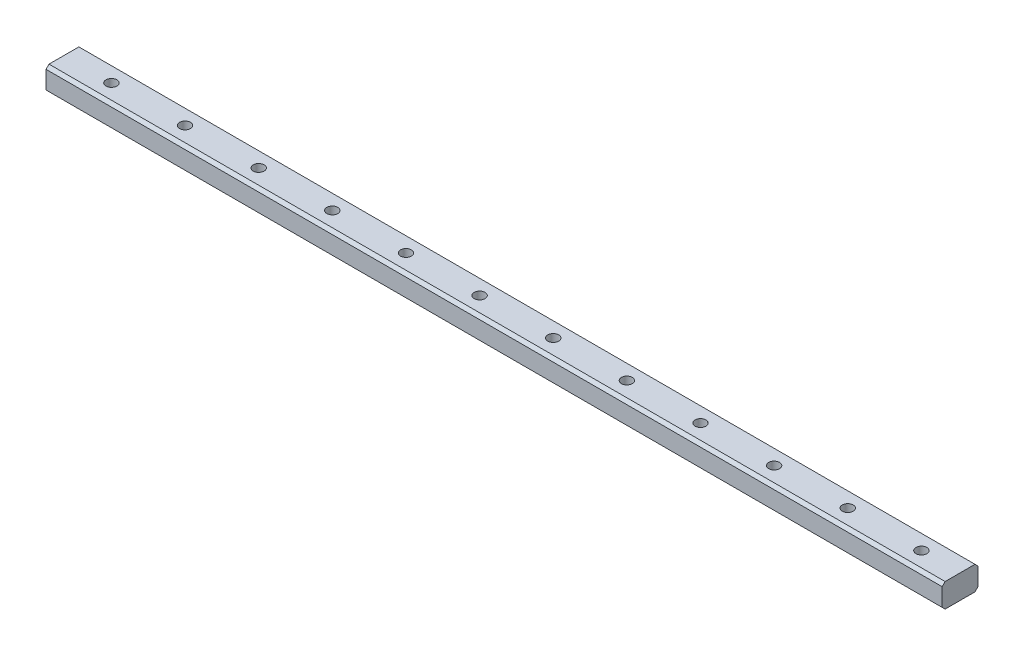
ISO-10303-21;
HEADER;
FILE_DESCRIPTION(('STEP AP214'),'2;1');
FILE_NAME('part.step','',(''),(''),'','','');
FILE_SCHEMA(('AUTOMOTIVE_DESIGN { 1 0 10303 214 1 1 1 1 }'));
ENDSEC;
DATA;
#1=APPLICATION_CONTEXT('core data for automotive mechanical design processes');
#2=APPLICATION_PROTOCOL_DEFINITION('international standard','automotive_design',2000,#1);
#3=PRODUCT_CONTEXT('',#1,'mechanical');
#4=PRODUCT('Part','Part','',(#3));
#5=PRODUCT_RELATED_PRODUCT_CATEGORY('part','',(#4));
#6=PRODUCT_DEFINITION_FORMATION('','',#4);
#7=PRODUCT_DEFINITION_CONTEXT('part definition',#1,'design');
#8=PRODUCT_DEFINITION('design','',#6,#7);
#9=PRODUCT_DEFINITION_SHAPE('','',#8);
#10=(LENGTH_UNIT() NAMED_UNIT(*) SI_UNIT(.MILLI.,.METRE.));
#11=(NAMED_UNIT(*) PLANE_ANGLE_UNIT() SI_UNIT($,.RADIAN.));
#12=(NAMED_UNIT(*) SI_UNIT($,.STERADIAN.) SOLID_ANGLE_UNIT());
#13=UNCERTAINTY_MEASURE_WITH_UNIT(LENGTH_MEASURE(1.E-05),#10,'distance_accuracy_value','');
#14=(GEOMETRIC_REPRESENTATION_CONTEXT(3) GLOBAL_UNCERTAINTY_ASSIGNED_CONTEXT((#13)) GLOBAL_UNIT_ASSIGNED_CONTEXT((#10,
#11,#12)) REPRESENTATION_CONTEXT('',''));
#15=CARTESIAN_POINT('',(0.,0.,0.));
#16=DIRECTION('',(0.,0.,1.));
#17=DIRECTION('',(1.,0.,0.));
#18=AXIS2_PLACEMENT_3D('',#15,#16,#17);
#19=CARTESIAN_POINT('',(-150.,8.,6.00000000000002));
#20=DIRECTION('',(1.,0.,0.));
#21=DIRECTION('',(0.,0.,-1.));
#22=AXIS2_PLACEMENT_3D('',#19,#20,#21);
#23=PLANE('',#22);
#24=DIRECTION('',(0.,-1.,0.));
#25=VECTOR('',#24,1.);
#26=CARTESIAN_POINT('',(-150.,8.,-5.99999999999999));
#27=LINE('',#26,#25);
#28=CARTESIAN_POINT('',(-150.,7.,-5.99999999999999));
#29=VERTEX_POINT('',#28);
#30=CARTESIAN_POINT('',(-150.,0.999999999999973,-5.99999999999999));
#31=VERTEX_POINT('',#30);
#32=EDGE_CURVE('E115',#29,#31,#27,.T.);
#33=ORIENTED_EDGE('',*,*,#32,.T.);
#34=DIRECTION('',(0.,0.707106781186538,-0.707106781186557));
#35=VECTOR('',#34,1.);
#36=CARTESIAN_POINT('',(-150.,0.99999999999999,-6.));
#37=LINE('',#36,#35);
#38=CARTESIAN_POINT('',(-150.,0.,-4.99999999999998));
#39=VERTEX_POINT('',#38);
#40=EDGE_CURVE('E155',#31,#39,#37,.F.);
#41=ORIENTED_EDGE('',*,*,#40,.T.);
#42=DIRECTION('',(0.,0.,1.));
#43=VECTOR('',#42,1.);
#44=CARTESIAN_POINT('',(-150.,0.,6.00000000000002));
#45=LINE('',#44,#43);
#46=CARTESIAN_POINT('',(-150.,0.,5.00000000000002));
#47=VERTEX_POINT('',#46);
#48=EDGE_CURVE('E253',#39,#47,#45,.T.);
#49=ORIENTED_EDGE('',*,*,#48,.T.);
#50=DIRECTION('',(0.,-0.707106781186538,-0.707106781186557));
#51=VECTOR('',#50,1.);
#52=CARTESIAN_POINT('',(-150.,0.999999999999954,6.));
#53=LINE('',#52,#51);
#54=CARTESIAN_POINT('',(-150.,0.999999999999973,6.00000000000002));
#55=VERTEX_POINT('',#54);
#56=EDGE_CURVE('E152',#47,#55,#53,.F.);
#57=ORIENTED_EDGE('',*,*,#56,.T.);
#58=DIRECTION('',(0.,-1.,0.));
#59=VECTOR('',#58,1.);
#60=CARTESIAN_POINT('',(-150.,8.,6.00000000000002));
#61=LINE('',#60,#59);
#62=CARTESIAN_POINT('',(-150.,7.,6.00000000000002));
#63=VERTEX_POINT('',#62);
#64=EDGE_CURVE('E140',#63,#55,#61,.T.);
#65=ORIENTED_EDGE('',*,*,#64,.F.);
#66=DIRECTION('',(0.,0.707106781186557,-0.707106781186538));
#67=VECTOR('',#66,1.);
#68=CARTESIAN_POINT('',(-150.,8.00000000000001,5.00000000000004));
#69=LINE('',#68,#67);
#70=CARTESIAN_POINT('',(-150.,8.,5.00000000000005));
#71=VERTEX_POINT('',#70);
#72=EDGE_CURVE('E123',#63,#71,#69,.T.);
#73=ORIENTED_EDGE('',*,*,#72,.T.);
#74=DIRECTION('',(0.,0.,1.));
#75=VECTOR('',#74,1.);
#76=CARTESIAN_POINT('',(-150.,8.,6.00000000000002));
#77=LINE('',#76,#75);
#78=CARTESIAN_POINT('',(-150.,8.,-5.00000000000001));
#79=VERTEX_POINT('',#78);
#80=EDGE_CURVE('E117',#79,#71,#77,.T.);
#81=ORIENTED_EDGE('',*,*,#80,.F.);
#82=DIRECTION('',(0.,-0.707106781186557,-0.707106781186538));
#83=VECTOR('',#82,1.);
#84=CARTESIAN_POINT('',(-150.,7.99999999999999,-5.00000000000002));
#85=LINE('',#84,#83);
#86=EDGE_CURVE('E113',#79,#29,#85,.T.);
#87=ORIENTED_EDGE('',*,*,#86,.T.);
#88=EDGE_LOOP('',(#33,#41,#49,#57,#65,#73,#81,#87));
#89=FACE_BOUND('',#88,.T.);
#90=ADVANCED_FACE('F42',(#89),#23,.F.);
#91=CARTESIAN_POINT('',(150.,8.,5.99999999999998));
#92=DIRECTION('',(0.,0.,-1.));
#93=DIRECTION('',(-1.,0.,0.));
#94=AXIS2_PLACEMENT_3D('',#91,#92,#93);
#95=PLANE('',#94);
#96=ORIENTED_EDGE('',*,*,#64,.T.);
#97=DIRECTION('',(1.,0.,0.));
#98=VECTOR('',#97,1.);
#99=CARTESIAN_POINT('',(150.,0.999999999999973,5.99999999999998));
#100=LINE('',#99,#98);
#101=CARTESIAN_POINT('',(150.,0.999999999999973,5.99999999999998));
#102=VERTEX_POINT('',#101);
#103=EDGE_CURVE('E176',#55,#102,#100,.T.);
#104=ORIENTED_EDGE('',*,*,#103,.T.);
#105=DIRECTION('',(0.,-1.,0.));
#106=VECTOR('',#105,1.);
#107=CARTESIAN_POINT('',(150.,8.,5.99999999999998));
#108=LINE('',#107,#106);
#109=CARTESIAN_POINT('',(150.,7.,5.99999999999998));
#110=VERTEX_POINT('',#109);
#111=EDGE_CURVE('E146',#110,#102,#108,.T.);
#112=ORIENTED_EDGE('',*,*,#111,.F.);
#113=DIRECTION('',(-1.,0.,0.));
#114=VECTOR('',#113,1.);
#115=CARTESIAN_POINT('',(-150.,7.,6.00000000000002));
#116=LINE('',#115,#114);
#117=EDGE_CURVE('E173',#110,#63,#116,.T.);
#118=ORIENTED_EDGE('',*,*,#117,.T.);
#119=EDGE_LOOP('',(#96,#104,#112,#118));
#120=FACE_BOUND('',#119,.T.);
#121=ADVANCED_FACE('F275',(#120),#95,.F.);
#122=CARTESIAN_POINT('',(150.,8.,5.99999999999998));
#123=DIRECTION('',(-1.,0.,0.));
#124=DIRECTION('',(0.,0.,1.));
#125=AXIS2_PLACEMENT_3D('',#122,#123,#124);
#126=PLANE('',#125);
#127=DIRECTION('',(0.,0.,-1.));
#128=VECTOR('',#127,1.);
#129=CARTESIAN_POINT('',(150.,0.,5.99999999999998));
#130=LINE('',#129,#128);
#131=CARTESIAN_POINT('',(150.,0.,4.99999999999998));
#132=VERTEX_POINT('',#131);
#133=CARTESIAN_POINT('',(150.,0.,-5.00000000000002));
#134=VERTEX_POINT('',#133);
#135=EDGE_CURVE('E259',#132,#134,#130,.T.);
#136=ORIENTED_EDGE('',*,*,#135,.T.);
#137=DIRECTION('',(0.,-0.707106781186538,0.707106781186557));
#138=VECTOR('',#137,1.);
#139=CARTESIAN_POINT('',(150.,0.999999999999973,-6.00000000000002));
#140=LINE('',#139,#138);
#141=CARTESIAN_POINT('',(150.,0.999999999999973,-6.00000000000002));
#142=VERTEX_POINT('',#141);
#143=EDGE_CURVE('E170',#134,#142,#140,.F.);
#144=ORIENTED_EDGE('',*,*,#143,.T.);
#145=DIRECTION('',(0.,-1.,0.));
#146=VECTOR('',#145,1.);
#147=CARTESIAN_POINT('',(150.,8.,-6.00000000000002));
#148=LINE('',#147,#146);
#149=CARTESIAN_POINT('',(150.,7.,-6.00000000000002));
#150=VERTEX_POINT('',#149);
#151=EDGE_CURVE('E134',#150,#142,#148,.T.);
#152=ORIENTED_EDGE('',*,*,#151,.F.);
#153=DIRECTION('',(0.,0.707106781186557,0.707106781186538));
#154=VECTOR('',#153,1.);
#155=CARTESIAN_POINT('',(150.,8.00000000000001,-5.00000000000004));
#156=LINE('',#155,#154);
#157=CARTESIAN_POINT('',(150.,8.,-5.00000000000005));
#158=VERTEX_POINT('',#157);
#159=EDGE_CURVE('E138',#150,#158,#156,.T.);
#160=ORIENTED_EDGE('',*,*,#159,.T.);
#161=DIRECTION('',(0.,0.,-1.));
#162=VECTOR('',#161,1.);
#163=CARTESIAN_POINT('',(150.,8.,5.99999999999998));
#164=LINE('',#163,#162);
#165=CARTESIAN_POINT('',(150.,8.,5.00000000000001));
#166=VERTEX_POINT('',#165);
#167=EDGE_CURVE('E135',#166,#158,#164,.T.);
#168=ORIENTED_EDGE('',*,*,#167,.F.);
#169=DIRECTION('',(0.,-0.707106781186557,0.707106781186538));
#170=VECTOR('',#169,1.);
#171=CARTESIAN_POINT('',(150.,7.99999999999999,5.00000000000002));
#172=LINE('',#171,#170);
#173=EDGE_CURVE('E69',#166,#110,#172,.T.);
#174=ORIENTED_EDGE('',*,*,#173,.T.);
#175=ORIENTED_EDGE('',*,*,#111,.T.);
#176=DIRECTION('',(0.,0.707106781186538,0.707106781186557));
#177=VECTOR('',#176,1.);
#178=CARTESIAN_POINT('',(150.,0.999999999999973,5.99999999999998));
#179=LINE('',#178,#177);
#180=EDGE_CURVE('E61',#102,#132,#179,.F.);
#181=ORIENTED_EDGE('',*,*,#180,.T.);
#182=EDGE_LOOP('',(#136,#144,#152,#160,#168,#174,#175,#181));
#183=FACE_BOUND('',#182,.T.);
#184=ADVANCED_FACE('F271',(#183),#126,.F.);
#185=CARTESIAN_POINT('',(150.,8.,-6.00000000000002));
#186=DIRECTION('',(0.,0.,1.));
#187=DIRECTION('',(1.,0.,0.));
#188=AXIS2_PLACEMENT_3D('',#185,#186,#187);
#189=PLANE('',#188);
#190=ORIENTED_EDGE('',*,*,#151,.T.);
#191=DIRECTION('',(-1.,0.,0.));
#192=VECTOR('',#191,1.);
#193=CARTESIAN_POINT('',(150.,0.999999999999973,-6.00000000000002));
#194=LINE('',#193,#192);
#195=EDGE_CURVE('E124',#142,#31,#194,.T.);
#196=ORIENTED_EDGE('',*,*,#195,.T.);
#197=ORIENTED_EDGE('',*,*,#32,.F.);
#198=DIRECTION('',(1.,0.,0.));
#199=VECTOR('',#198,1.);
#200=CARTESIAN_POINT('',(150.,7.,-6.00000000000002));
#201=LINE('',#200,#199);
#202=EDGE_CURVE('E130',#29,#150,#201,.T.);
#203=ORIENTED_EDGE('',*,*,#202,.T.);
#204=EDGE_LOOP('',(#190,#196,#197,#203));
#205=FACE_BOUND('',#204,.T.);
#206=ADVANCED_FACE('F129',(#205),#189,.F.);
#207=CARTESIAN_POINT('',(0.,8.,0.));
#208=DIRECTION('',(0.,1.,0.));
#209=DIRECTION('',(0.,0.,1.));
#210=AXIS2_PLACEMENT_3D('',#207,#208,#209);
#211=PLANE('',#210);
#212=CARTESIAN_POINT('',(112.4,8.,0.));
#213=DIRECTION('',(0.,1.,0.));
#214=DIRECTION('',(0.,0.,1.));
#215=AXIS2_PLACEMENT_3D('',#212,#213,#214);
#216=CIRCLE('',#215,1.82499999999999);
#217=CARTESIAN_POINT('',(112.4,8.,1.82499999999999));
#218=VERTEX_POINT('',#217);
#219=EDGE_CURVE('E192',#218,#218,#216,.T.);
#220=ORIENTED_EDGE('',*,*,#219,.F.);
#221=EDGE_LOOP('',(#220));
#222=FACE_BOUND('',#221,.T.);
#223=CARTESIAN_POINT('',(87.7499999999999,8.,0.));
#224=DIRECTION('',(0.,1.,0.));
#225=DIRECTION('',(0.,0.,1.));
#226=AXIS2_PLACEMENT_3D('',#223,#224,#225);
#227=CIRCLE('',#226,1.82499999999999);
#228=CARTESIAN_POINT('',(87.7499999999999,8.,1.82499999999999));
#229=VERTEX_POINT('',#228);
#230=EDGE_CURVE('E640',#229,#229,#227,.T.);
#231=ORIENTED_EDGE('',*,*,#230,.F.);
#232=EDGE_LOOP('',(#231));
#233=FACE_BOUND('',#232,.T.);
#234=CARTESIAN_POINT('',(63.0999999999999,8.,0.));
#235=DIRECTION('',(0.,1.,0.));
#236=DIRECTION('',(0.,0.,1.));
#237=AXIS2_PLACEMENT_3D('',#234,#235,#236);
#238=CIRCLE('',#237,1.82499999999999);
#239=CARTESIAN_POINT('',(63.0999999999999,8.,1.82499999999999));
#240=VERTEX_POINT('',#239);
#241=EDGE_CURVE('E636',#240,#240,#238,.T.);
#242=ORIENTED_EDGE('',*,*,#241,.F.);
#243=EDGE_LOOP('',(#242));
#244=FACE_BOUND('',#243,.T.);
#245=CARTESIAN_POINT('',(38.4499999999999,8.,0.));
#246=DIRECTION('',(0.,1.,0.));
#247=DIRECTION('',(0.,0.,1.));
#248=AXIS2_PLACEMENT_3D('',#245,#246,#247);
#249=CIRCLE('',#248,1.82499999999999);
#250=CARTESIAN_POINT('',(38.4499999999999,8.,1.82499999999999));
#251=VERTEX_POINT('',#250);
#252=EDGE_CURVE('E632',#251,#251,#249,.T.);
#253=ORIENTED_EDGE('',*,*,#252,.F.);
#254=EDGE_LOOP('',(#253));
#255=FACE_BOUND('',#254,.T.);
#256=CARTESIAN_POINT('',(13.7999999999999,8.,0.));
#257=DIRECTION('',(0.,1.,0.));
#258=DIRECTION('',(0.,0.,1.));
#259=AXIS2_PLACEMENT_3D('',#256,#257,#258);
#260=CIRCLE('',#259,1.82499999999999);
#261=CARTESIAN_POINT('',(13.7999999999999,8.,1.82499999999999));
#262=VERTEX_POINT('',#261);
#263=EDGE_CURVE('E628',#262,#262,#260,.T.);
#264=ORIENTED_EDGE('',*,*,#263,.F.);
#265=EDGE_LOOP('',(#264));
#266=FACE_BOUND('',#265,.T.);
#267=CARTESIAN_POINT('',(-10.8500000000001,8.,0.));
#268=DIRECTION('',(0.,1.,0.));
#269=DIRECTION('',(0.,0.,1.));
#270=AXIS2_PLACEMENT_3D('',#267,#268,#269);
#271=CIRCLE('',#270,1.82499999999999);
#272=CARTESIAN_POINT('',(-10.8500000000001,8.,1.82499999999999));
#273=VERTEX_POINT('',#272);
#274=EDGE_CURVE('E624',#273,#273,#271,.T.);
#275=ORIENTED_EDGE('',*,*,#274,.F.);
#276=EDGE_LOOP('',(#275));
#277=FACE_BOUND('',#276,.T.);
#278=CARTESIAN_POINT('',(-35.5000000000001,8.,0.));
#279=DIRECTION('',(0.,1.,0.));
#280=DIRECTION('',(0.,0.,1.));
#281=AXIS2_PLACEMENT_3D('',#278,#279,#280);
#282=CIRCLE('',#281,1.82499999999999);
#283=CARTESIAN_POINT('',(-35.5000000000001,8.,1.82499999999999));
#284=VERTEX_POINT('',#283);
#285=EDGE_CURVE('E620',#284,#284,#282,.T.);
#286=ORIENTED_EDGE('',*,*,#285,.F.);
#287=EDGE_LOOP('',(#286));
#288=FACE_BOUND('',#287,.T.);
#289=CARTESIAN_POINT('',(-60.1500000000001,8.,0.));
#290=DIRECTION('',(0.,1.,0.));
#291=DIRECTION('',(0.,0.,1.));
#292=AXIS2_PLACEMENT_3D('',#289,#290,#291);
#293=CIRCLE('',#292,1.82499999999999);
#294=CARTESIAN_POINT('',(-60.1500000000001,8.,1.82499999999999));
#295=VERTEX_POINT('',#294);
#296=EDGE_CURVE('E616',#295,#295,#293,.T.);
#297=ORIENTED_EDGE('',*,*,#296,.F.);
#298=EDGE_LOOP('',(#297));
#299=FACE_BOUND('',#298,.T.);
#300=CARTESIAN_POINT('',(-84.8000000000001,8.,0.));
#301=DIRECTION('',(0.,1.,0.));
#302=DIRECTION('',(0.,0.,1.));
#303=AXIS2_PLACEMENT_3D('',#300,#301,#302);
#304=CIRCLE('',#303,1.82499999999999);
#305=CARTESIAN_POINT('',(-84.8000000000001,8.,1.82499999999999));
#306=VERTEX_POINT('',#305);
#307=EDGE_CURVE('E612',#306,#306,#304,.T.);
#308=ORIENTED_EDGE('',*,*,#307,.F.);
#309=EDGE_LOOP('',(#308));
#310=FACE_BOUND('',#309,.T.);
#311=CARTESIAN_POINT('',(-109.45,8.,0.));
#312=DIRECTION('',(0.,1.,0.));
#313=DIRECTION('',(0.,0.,1.));
#314=AXIS2_PLACEMENT_3D('',#311,#312,#313);
#315=CIRCLE('',#314,1.82499999999999);
#316=CARTESIAN_POINT('',(-109.45,8.,1.82499999999999));
#317=VERTEX_POINT('',#316);
#318=EDGE_CURVE('E608',#317,#317,#315,.T.);
#319=ORIENTED_EDGE('',*,*,#318,.F.);
#320=EDGE_LOOP('',(#319));
#321=FACE_BOUND('',#320,.T.);
#322=CARTESIAN_POINT('',(-134.1,8.,0.));
#323=DIRECTION('',(0.,1.,0.));
#324=DIRECTION('',(0.,0.,1.));
#325=AXIS2_PLACEMENT_3D('',#322,#323,#324);
#326=CIRCLE('',#325,1.82499999999999);
#327=CARTESIAN_POINT('',(-134.1,8.,1.82499999999999));
#328=VERTEX_POINT('',#327);
#329=EDGE_CURVE('E487',#328,#328,#326,.T.);
#330=ORIENTED_EDGE('',*,*,#329,.F.);
#331=EDGE_LOOP('',(#330));
#332=FACE_BOUND('',#331,.T.);
#333=CARTESIAN_POINT('',(137.05,8.,0.));
#334=DIRECTION('',(0.,1.,0.));
#335=DIRECTION('',(0.,0.,1.));
#336=AXIS2_PLACEMENT_3D('',#333,#334,#335);
#337=CIRCLE('',#336,1.82499999999999);
#338=CARTESIAN_POINT('',(137.05,8.,1.82499999999999));
#339=VERTEX_POINT('',#338);
#340=EDGE_CURVE('E186',#339,#339,#337,.T.);
#341=ORIENTED_EDGE('',*,*,#340,.F.);
#342=EDGE_LOOP('',(#341));
#343=FACE_BOUND('',#342,.T.);
#344=ORIENTED_EDGE('',*,*,#80,.T.);
#345=DIRECTION('',(1.,0.,0.));
#346=VECTOR('',#345,1.);
#347=CARTESIAN_POINT('',(150.,8.,5.00000000000001));
#348=LINE('',#347,#346);
#349=EDGE_CURVE('E11',#71,#166,#348,.T.);
#350=ORIENTED_EDGE('',*,*,#349,.T.);
#351=ORIENTED_EDGE('',*,*,#167,.T.);
#352=DIRECTION('',(-1.,0.,0.));
#353=VECTOR('',#352,1.);
#354=CARTESIAN_POINT('',(-150.,8.,-5.00000000000001));
#355=LINE('',#354,#353);
#356=EDGE_CURVE('E53',#158,#79,#355,.T.);
#357=ORIENTED_EDGE('',*,*,#356,.T.);
#358=EDGE_LOOP('',(#344,#350,#351,#357));
#359=FACE_BOUND('',#358,.T.);
#360=ADVANCED_FACE('F282',(#222,#233,#244,#255,#266,#277,#288,#299,#310,#321,#332,#343,#359),
#211,.T.);
#361=CARTESIAN_POINT('',(0.,0.,0.));
#362=DIRECTION('',(0.,1.,0.));
#363=DIRECTION('',(0.,0.,1.));
#364=AXIS2_PLACEMENT_3D('',#361,#362,#363);
#365=PLANE('',#364);
#366=CARTESIAN_POINT('',(112.4,0.,0.));
#367=DIRECTION('',(0.,1.,0.));
#368=DIRECTION('',(0.,0.,1.));
#369=AXIS2_PLACEMENT_3D('',#366,#367,#368);
#370=CIRCLE('',#369,2.95);
#371=CARTESIAN_POINT('',(112.4,0.,2.95));
#372=VERTEX_POINT('',#371);
#373=EDGE_CURVE('E480',#372,#372,#370,.T.);
#374=ORIENTED_EDGE('',*,*,#373,.T.);
#375=EDGE_LOOP('',(#374));
#376=FACE_BOUND('',#375,.T.);
#377=CARTESIAN_POINT('',(87.7499999999999,0.,0.));
#378=DIRECTION('',(0.,1.,0.));
#379=DIRECTION('',(0.,0.,1.));
#380=AXIS2_PLACEMENT_3D('',#377,#378,#379);
#381=CIRCLE('',#380,2.95);
#382=CARTESIAN_POINT('',(87.7499999999999,0.,2.95));
#383=VERTEX_POINT('',#382);
#384=EDGE_CURVE('E493',#383,#383,#381,.T.);
#385=ORIENTED_EDGE('',*,*,#384,.T.);
#386=EDGE_LOOP('',(#385));
#387=FACE_BOUND('',#386,.T.);
#388=CARTESIAN_POINT('',(63.0999999999999,0.,0.));
#389=DIRECTION('',(0.,1.,0.));
#390=DIRECTION('',(0.,0.,1.));
#391=AXIS2_PLACEMENT_3D('',#388,#389,#390);
#392=CIRCLE('',#391,2.95);
#393=CARTESIAN_POINT('',(63.0999999999999,0.,2.95));
#394=VERTEX_POINT('',#393);
#395=EDGE_CURVE('E501',#394,#394,#392,.T.);
#396=ORIENTED_EDGE('',*,*,#395,.T.);
#397=EDGE_LOOP('',(#396));
#398=FACE_BOUND('',#397,.T.);
#399=CARTESIAN_POINT('',(38.4499999999999,0.,0.));
#400=DIRECTION('',(0.,1.,0.));
#401=DIRECTION('',(0.,0.,1.));
#402=AXIS2_PLACEMENT_3D('',#399,#400,#401);
#403=CIRCLE('',#402,2.95);
#404=CARTESIAN_POINT('',(38.4499999999999,0.,2.95));
#405=VERTEX_POINT('',#404);
#406=EDGE_CURVE('E509',#405,#405,#403,.T.);
#407=ORIENTED_EDGE('',*,*,#406,.T.);
#408=EDGE_LOOP('',(#407));
#409=FACE_BOUND('',#408,.T.);
#410=CARTESIAN_POINT('',(13.7999999999999,0.,0.));
#411=DIRECTION('',(0.,1.,0.));
#412=DIRECTION('',(0.,0.,1.));
#413=AXIS2_PLACEMENT_3D('',#410,#411,#412);
#414=CIRCLE('',#413,2.95);
#415=CARTESIAN_POINT('',(13.7999999999999,0.,2.95));
#416=VERTEX_POINT('',#415);
#417=EDGE_CURVE('E517',#416,#416,#414,.T.);
#418=ORIENTED_EDGE('',*,*,#417,.T.);
#419=EDGE_LOOP('',(#418));
#420=FACE_BOUND('',#419,.T.);
#421=CARTESIAN_POINT('',(-10.8500000000001,0.,0.));
#422=DIRECTION('',(0.,1.,0.));
#423=DIRECTION('',(0.,0.,1.));
#424=AXIS2_PLACEMENT_3D('',#421,#422,#423);
#425=CIRCLE('',#424,2.95);
#426=CARTESIAN_POINT('',(-10.8500000000001,0.,2.95));
#427=VERTEX_POINT('',#426);
#428=EDGE_CURVE('E525',#427,#427,#425,.T.);
#429=ORIENTED_EDGE('',*,*,#428,.T.);
#430=EDGE_LOOP('',(#429));
#431=FACE_BOUND('',#430,.T.);
#432=CARTESIAN_POINT('',(-35.5000000000001,0.,0.));
#433=DIRECTION('',(0.,1.,0.));
#434=DIRECTION('',(0.,0.,1.));
#435=AXIS2_PLACEMENT_3D('',#432,#433,#434);
#436=CIRCLE('',#435,2.95);
#437=CARTESIAN_POINT('',(-35.5000000000001,0.,2.95));
#438=VERTEX_POINT('',#437);
#439=EDGE_CURVE('E533',#438,#438,#436,.T.);
#440=ORIENTED_EDGE('',*,*,#439,.T.);
#441=EDGE_LOOP('',(#440));
#442=FACE_BOUND('',#441,.T.);
#443=CARTESIAN_POINT('',(-60.1500000000001,0.,0.));
#444=DIRECTION('',(0.,1.,0.));
#445=DIRECTION('',(0.,0.,1.));
#446=AXIS2_PLACEMENT_3D('',#443,#444,#445);
#447=CIRCLE('',#446,2.95);
#448=CARTESIAN_POINT('',(-60.1500000000001,0.,2.95));
#449=VERTEX_POINT('',#448);
#450=EDGE_CURVE('E541',#449,#449,#447,.T.);
#451=ORIENTED_EDGE('',*,*,#450,.T.);
#452=EDGE_LOOP('',(#451));
#453=FACE_BOUND('',#452,.T.);
#454=CARTESIAN_POINT('',(-84.8000000000001,0.,0.));
#455=DIRECTION('',(0.,1.,0.));
#456=DIRECTION('',(0.,0.,1.));
#457=AXIS2_PLACEMENT_3D('',#454,#455,#456);
#458=CIRCLE('',#457,2.95);
#459=CARTESIAN_POINT('',(-84.8000000000001,0.,2.95));
#460=VERTEX_POINT('',#459);
#461=EDGE_CURVE('E549',#460,#460,#458,.T.);
#462=ORIENTED_EDGE('',*,*,#461,.T.);
#463=EDGE_LOOP('',(#462));
#464=FACE_BOUND('',#463,.T.);
#465=CARTESIAN_POINT('',(-109.45,0.,0.));
#466=DIRECTION('',(0.,1.,0.));
#467=DIRECTION('',(0.,0.,1.));
#468=AXIS2_PLACEMENT_3D('',#465,#466,#467);
#469=CIRCLE('',#468,2.95);
#470=CARTESIAN_POINT('',(-109.45,0.,2.95));
#471=VERTEX_POINT('',#470);
#472=EDGE_CURVE('E241',#471,#471,#469,.T.);
#473=ORIENTED_EDGE('',*,*,#472,.T.);
#474=EDGE_LOOP('',(#473));
#475=FACE_BOUND('',#474,.T.);
#476=CARTESIAN_POINT('',(-134.1,0.,0.));
#477=DIRECTION('',(0.,1.,0.));
#478=DIRECTION('',(0.,0.,1.));
#479=AXIS2_PLACEMENT_3D('',#476,#477,#478);
#480=CIRCLE('',#479,2.95);
#481=CARTESIAN_POINT('',(-134.1,0.,2.95));
#482=VERTEX_POINT('',#481);
#483=EDGE_CURVE('E230',#482,#482,#480,.T.);
#484=ORIENTED_EDGE('',*,*,#483,.T.);
#485=EDGE_LOOP('',(#484));
#486=FACE_BOUND('',#485,.T.);
#487=CARTESIAN_POINT('',(137.05,0.,0.));
#488=DIRECTION('',(0.,1.,0.));
#489=DIRECTION('',(0.,0.,1.));
#490=AXIS2_PLACEMENT_3D('',#487,#488,#489);
#491=CIRCLE('',#490,2.95);
#492=CARTESIAN_POINT('',(137.05,0.,2.95));
#493=VERTEX_POINT('',#492);
#494=EDGE_CURVE('E185',#493,#493,#491,.T.);
#495=ORIENTED_EDGE('',*,*,#494,.T.);
#496=EDGE_LOOP('',(#495));
#497=FACE_BOUND('',#496,.T.);
#498=ORIENTED_EDGE('',*,*,#48,.F.);
#499=DIRECTION('',(1.,0.,0.));
#500=VECTOR('',#499,1.);
#501=CARTESIAN_POINT('',(0.,0.,-5.));
#502=LINE('',#501,#500);
#503=EDGE_CURVE('E161',#39,#134,#502,.T.);
#504=ORIENTED_EDGE('',*,*,#503,.T.);
#505=ORIENTED_EDGE('',*,*,#135,.F.);
#506=DIRECTION('',(-1.,0.,0.));
#507=VECTOR('',#506,1.);
#508=CARTESIAN_POINT('',(0.,0.,5.));
#509=LINE('',#508,#507);
#510=EDGE_CURVE('E158',#132,#47,#509,.T.);
#511=ORIENTED_EDGE('',*,*,#510,.T.);
#512=EDGE_LOOP('',(#498,#504,#505,#511));
#513=FACE_BOUND('',#512,.T.);
#514=ADVANCED_FACE('F290',(#376,#387,#398,#409,#420,#431,#442,#453,#464,#475,#486,#497,#513),
#365,.F.);
#515=CARTESIAN_POINT('',(150.,0.999999999999973,-6.00000000000002));
#516=DIRECTION('',(0.,0.707106781186557,0.707106781186538));
#517=DIRECTION('',(-1.,0.,0.));
#518=AXIS2_PLACEMENT_3D('',#515,#516,#517);
#519=PLANE('',#518);
#520=ORIENTED_EDGE('',*,*,#143,.F.);
#521=ORIENTED_EDGE('',*,*,#503,.F.);
#522=ORIENTED_EDGE('',*,*,#40,.F.);
#523=ORIENTED_EDGE('',*,*,#195,.F.);
#524=EDGE_LOOP('',(#520,#521,#522,#523));
#525=FACE_BOUND('',#524,.T.);
#526=ADVANCED_FACE('F285',(#525),#519,.F.);
#527=CARTESIAN_POINT('',(150.,0.999999999999973,5.99999999999998));
#528=DIRECTION('',(0.,0.707106781186557,-0.707106781186538));
#529=DIRECTION('',(1.,0.,0.));
#530=AXIS2_PLACEMENT_3D('',#527,#528,#529);
#531=PLANE('',#530);
#532=ORIENTED_EDGE('',*,*,#56,.F.);
#533=ORIENTED_EDGE('',*,*,#510,.F.);
#534=ORIENTED_EDGE('',*,*,#180,.F.);
#535=ORIENTED_EDGE('',*,*,#103,.F.);
#536=EDGE_LOOP('',(#532,#533,#534,#535));
#537=FACE_BOUND('',#536,.T.);
#538=ADVANCED_FACE('F291',(#537),#531,.F.);
#539=CARTESIAN_POINT('',(0.,8.,5.00000000000003));
#540=DIRECTION('',(0.,0.707106781186538,0.707106781186557));
#541=DIRECTION('',(-1.,0.,0.));
#542=AXIS2_PLACEMENT_3D('',#539,#540,#541);
#543=PLANE('',#542);
#544=ORIENTED_EDGE('',*,*,#72,.F.);
#545=ORIENTED_EDGE('',*,*,#117,.F.);
#546=ORIENTED_EDGE('',*,*,#173,.F.);
#547=ORIENTED_EDGE('',*,*,#349,.F.);
#548=EDGE_LOOP('',(#544,#545,#546,#547));
#549=FACE_BOUND('',#548,.T.);
#550=ADVANCED_FACE('F279',(#549),#543,.T.);
#551=CARTESIAN_POINT('',(0.,8.,-5.00000000000003));
#552=DIRECTION('',(0.,0.707106781186538,-0.707106781186557));
#553=DIRECTION('',(1.,0.,0.));
#554=AXIS2_PLACEMENT_3D('',#551,#552,#553);
#555=PLANE('',#554);
#556=ORIENTED_EDGE('',*,*,#159,.F.);
#557=ORIENTED_EDGE('',*,*,#202,.F.);
#558=ORIENTED_EDGE('',*,*,#86,.F.);
#559=ORIENTED_EDGE('',*,*,#356,.F.);
#560=EDGE_LOOP('',(#556,#557,#558,#559));
#561=FACE_BOUND('',#560,.T.);
#562=ADVANCED_FACE('F45',(#561),#555,.T.);
#563=CARTESIAN_POINT('',(137.05,5.05,0.));
#564=DIRECTION('',(0.,-1.,0.));
#565=DIRECTION('',(0.,0.,-1.));
#566=AXIS2_PLACEMENT_3D('',#563,#564,#565);
#567=CYLINDRICAL_SURFACE('',#566,2.95);
#568=CARTESIAN_POINT('',(137.05,5.05,0.));
#569=DIRECTION('',(0.,1.,0.));
#570=DIRECTION('',(0.,0.,1.));
#571=AXIS2_PLACEMENT_3D('',#568,#569,#570);
#572=CIRCLE('',#571,2.95);
#573=CARTESIAN_POINT('',(137.05,5.05,2.95));
#574=VERTEX_POINT('',#573);
#575=EDGE_CURVE('E249',#574,#574,#572,.T.);
#576=ORIENTED_EDGE('',*,*,#575,.T.);
#577=EDGE_LOOP('',(#576));
#578=FACE_BOUND('',#577,.T.);
#579=ORIENTED_EDGE('',*,*,#494,.F.);
#580=EDGE_LOOP('',(#579));
#581=FACE_BOUND('',#580,.T.);
#582=ADVANCED_FACE('F327',(#578,#581),#567,.F.);
#583=CARTESIAN_POINT('',(137.05,5.05,0.));
#584=DIRECTION('',(0.,1.,0.));
#585=DIRECTION('',(0.,0.,1.));
#586=AXIS2_PLACEMENT_3D('',#583,#584,#585);
#587=PLANE('',#586);
#588=CARTESIAN_POINT('',(137.05,5.05,0.));
#589=DIRECTION('',(0.,1.,0.));
#590=DIRECTION('',(0.,0.,1.));
#591=AXIS2_PLACEMENT_3D('',#588,#589,#590);
#592=CIRCLE('',#591,1.82499999999999);
#593=CARTESIAN_POINT('',(137.05,5.05,1.82499999999999));
#594=VERTEX_POINT('',#593);
#595=EDGE_CURVE('E181',#594,#594,#592,.F.);
#596=ORIENTED_EDGE('',*,*,#595,.F.);
#597=EDGE_LOOP('',(#596));
#598=FACE_BOUND('',#597,.T.);
#599=ORIENTED_EDGE('',*,*,#575,.F.);
#600=EDGE_LOOP('',(#599));
#601=FACE_BOUND('',#600,.T.);
#602=ADVANCED_FACE('F330',(#598,#601),#587,.F.);
#603=CARTESIAN_POINT('',(137.05,8.,0.));
#604=DIRECTION('',(0.,-1.,0.));
#605=DIRECTION('',(0.,0.,-1.));
#606=AXIS2_PLACEMENT_3D('',#603,#604,#605);
#607=CYLINDRICAL_SURFACE('',#606,1.82499999999999);
#608=ORIENTED_EDGE('',*,*,#340,.T.);
#609=EDGE_LOOP('',(#608));
#610=FACE_BOUND('',#609,.T.);
#611=ORIENTED_EDGE('',*,*,#595,.T.);
#612=EDGE_LOOP('',(#611));
#613=FACE_BOUND('',#612,.T.);
#614=ADVANCED_FACE('F334',(#610,#613),#607,.F.);
#615=CARTESIAN_POINT('',(-134.1,5.05,0.));
#616=DIRECTION('',(0.,-1.,0.));
#617=DIRECTION('',(0.,0.,-1.));
#618=AXIS2_PLACEMENT_3D('',#615,#616,#617);
#619=CYLINDRICAL_SURFACE('',#618,2.95);
#620=CARTESIAN_POINT('',(-134.1,5.05,0.));
#621=DIRECTION('',(0.,1.,0.));
#622=DIRECTION('',(0.,0.,1.));
#623=AXIS2_PLACEMENT_3D('',#620,#621,#622);
#624=CIRCLE('',#623,2.95);
#625=CARTESIAN_POINT('',(-134.1,5.05,2.95));
#626=VERTEX_POINT('',#625);
#627=EDGE_CURVE('E235',#626,#626,#624,.T.);
#628=ORIENTED_EDGE('',*,*,#627,.T.);
#629=EDGE_LOOP('',(#628));
#630=FACE_BOUND('',#629,.T.);
#631=ORIENTED_EDGE('',*,*,#483,.F.);
#632=EDGE_LOOP('',(#631));
#633=FACE_BOUND('',#632,.T.);
#634=ADVANCED_FACE('F338',(#630,#633),#619,.F.);
#635=CARTESIAN_POINT('',(-134.1,5.05,0.));
#636=DIRECTION('',(0.,1.,0.));
#637=DIRECTION('',(0.,0.,1.));
#638=AXIS2_PLACEMENT_3D('',#635,#636,#637);
#639=PLANE('',#638);
#640=CARTESIAN_POINT('',(-134.1,5.05,0.));
#641=DIRECTION('',(0.,1.,0.));
#642=DIRECTION('',(0.,0.,1.));
#643=AXIS2_PLACEMENT_3D('',#640,#641,#642);
#644=CIRCLE('',#643,1.82499999999999);
#645=CARTESIAN_POINT('',(-134.1,5.05,1.82499999999999));
#646=VERTEX_POINT('',#645);
#647=EDGE_CURVE('E47',#646,#646,#644,.F.);
#648=ORIENTED_EDGE('',*,*,#647,.F.);
#649=EDGE_LOOP('',(#648));
#650=FACE_BOUND('',#649,.T.);
#651=ORIENTED_EDGE('',*,*,#627,.F.);
#652=EDGE_LOOP('',(#651));
#653=FACE_BOUND('',#652,.T.);
#654=ADVANCED_FACE('F342',(#650,#653),#639,.F.);
#655=CARTESIAN_POINT('',(-109.45,5.05,0.));
#656=DIRECTION('',(0.,-1.,0.));
#657=DIRECTION('',(0.,0.,-1.));
#658=AXIS2_PLACEMENT_3D('',#655,#656,#657);
#659=CYLINDRICAL_SURFACE('',#658,2.95);
#660=CARTESIAN_POINT('',(-109.45,5.05,0.));
#661=DIRECTION('',(0.,1.,0.));
#662=DIRECTION('',(0.,0.,1.));
#663=AXIS2_PLACEMENT_3D('',#660,#661,#662);
#664=CIRCLE('',#663,2.95);
#665=CARTESIAN_POINT('',(-109.45,5.05,2.95));
#666=VERTEX_POINT('',#665);
#667=EDGE_CURVE('E553',#666,#666,#664,.T.);
#668=ORIENTED_EDGE('',*,*,#667,.T.);
#669=EDGE_LOOP('',(#668));
#670=FACE_BOUND('',#669,.T.);
#671=ORIENTED_EDGE('',*,*,#472,.F.);
#672=EDGE_LOOP('',(#671));
#673=FACE_BOUND('',#672,.T.);
#674=ADVANCED_FACE('F346',(#670,#673),#659,.F.);
#675=CARTESIAN_POINT('',(-109.45,5.05,0.));
#676=DIRECTION('',(0.,1.,0.));
#677=DIRECTION('',(0.,0.,1.));
#678=AXIS2_PLACEMENT_3D('',#675,#676,#677);
#679=PLANE('',#678);
#680=CARTESIAN_POINT('',(-109.45,5.05,0.));
#681=DIRECTION('',(0.,1.,0.));
#682=DIRECTION('',(0.,0.,1.));
#683=AXIS2_PLACEMENT_3D('',#680,#681,#682);
#684=CIRCLE('',#683,1.82499999999999);
#685=CARTESIAN_POINT('',(-109.45,5.05,1.82499999999999));
#686=VERTEX_POINT('',#685);
#687=EDGE_CURVE('E223',#686,#686,#684,.F.);
#688=ORIENTED_EDGE('',*,*,#687,.F.);
#689=EDGE_LOOP('',(#688));
#690=FACE_BOUND('',#689,.T.);
#691=ORIENTED_EDGE('',*,*,#667,.F.);
#692=EDGE_LOOP('',(#691));
#693=FACE_BOUND('',#692,.T.);
#694=ADVANCED_FACE('F350',(#690,#693),#679,.F.);
#695=CARTESIAN_POINT('',(-84.8000000000001,5.05,0.));
#696=DIRECTION('',(0.,-1.,0.));
#697=DIRECTION('',(0.,0.,-1.));
#698=AXIS2_PLACEMENT_3D('',#695,#696,#697);
#699=CYLINDRICAL_SURFACE('',#698,2.95);
#700=CARTESIAN_POINT('',(-84.8000000000001,5.05,0.));
#701=DIRECTION('',(0.,1.,0.));
#702=DIRECTION('',(0.,0.,1.));
#703=AXIS2_PLACEMENT_3D('',#700,#701,#702);
#704=CIRCLE('',#703,2.95);
#705=CARTESIAN_POINT('',(-84.8000000000001,5.05,2.95));
#706=VERTEX_POINT('',#705);
#707=EDGE_CURVE('E545',#706,#706,#704,.T.);
#708=ORIENTED_EDGE('',*,*,#707,.T.);
#709=EDGE_LOOP('',(#708));
#710=FACE_BOUND('',#709,.T.);
#711=ORIENTED_EDGE('',*,*,#461,.F.);
#712=EDGE_LOOP('',(#711));
#713=FACE_BOUND('',#712,.T.);
#714=ADVANCED_FACE('F354',(#710,#713),#699,.F.);
#715=CARTESIAN_POINT('',(-84.8000000000001,5.05,0.));
#716=DIRECTION('',(0.,1.,0.));
#717=DIRECTION('',(0.,0.,1.));
#718=AXIS2_PLACEMENT_3D('',#715,#716,#717);
#719=PLANE('',#718);
#720=CARTESIAN_POINT('',(-84.8000000000001,5.05,0.));
#721=DIRECTION('',(0.,1.,0.));
#722=DIRECTION('',(0.,0.,1.));
#723=AXIS2_PLACEMENT_3D('',#720,#721,#722);
#724=CIRCLE('',#723,1.82499999999999);
#725=CARTESIAN_POINT('',(-84.8000000000001,5.05,1.82499999999999));
#726=VERTEX_POINT('',#725);
#727=EDGE_CURVE('E220',#726,#726,#724,.F.);
#728=ORIENTED_EDGE('',*,*,#727,.F.);
#729=EDGE_LOOP('',(#728));
#730=FACE_BOUND('',#729,.T.);
#731=ORIENTED_EDGE('',*,*,#707,.F.);
#732=EDGE_LOOP('',(#731));
#733=FACE_BOUND('',#732,.T.);
#734=ADVANCED_FACE('F358',(#730,#733),#719,.F.);
#735=CARTESIAN_POINT('',(-60.1500000000001,5.05,0.));
#736=DIRECTION('',(0.,-1.,0.));
#737=DIRECTION('',(0.,0.,-1.));
#738=AXIS2_PLACEMENT_3D('',#735,#736,#737);
#739=CYLINDRICAL_SURFACE('',#738,2.95);
#740=CARTESIAN_POINT('',(-60.1500000000001,5.05,0.));
#741=DIRECTION('',(0.,1.,0.));
#742=DIRECTION('',(0.,0.,1.));
#743=AXIS2_PLACEMENT_3D('',#740,#741,#742);
#744=CIRCLE('',#743,2.95);
#745=CARTESIAN_POINT('',(-60.1500000000001,5.05,2.95));
#746=VERTEX_POINT('',#745);
#747=EDGE_CURVE('E537',#746,#746,#744,.T.);
#748=ORIENTED_EDGE('',*,*,#747,.T.);
#749=EDGE_LOOP('',(#748));
#750=FACE_BOUND('',#749,.T.);
#751=ORIENTED_EDGE('',*,*,#450,.F.);
#752=EDGE_LOOP('',(#751));
#753=FACE_BOUND('',#752,.T.);
#754=ADVANCED_FACE('F362',(#750,#753),#739,.F.);
#755=CARTESIAN_POINT('',(-60.1500000000001,5.05,0.));
#756=DIRECTION('',(0.,1.,0.));
#757=DIRECTION('',(0.,0.,1.));
#758=AXIS2_PLACEMENT_3D('',#755,#756,#757);
#759=PLANE('',#758);
#760=CARTESIAN_POINT('',(-60.1500000000001,5.05,0.));
#761=DIRECTION('',(0.,1.,0.));
#762=DIRECTION('',(0.,0.,1.));
#763=AXIS2_PLACEMENT_3D('',#760,#761,#762);
#764=CIRCLE('',#763,1.82499999999999);
#765=CARTESIAN_POINT('',(-60.1500000000001,5.05,1.82499999999999));
#766=VERTEX_POINT('',#765);
#767=EDGE_CURVE('E216',#766,#766,#764,.F.);
#768=ORIENTED_EDGE('',*,*,#767,.F.);
#769=EDGE_LOOP('',(#768));
#770=FACE_BOUND('',#769,.T.);
#771=ORIENTED_EDGE('',*,*,#747,.F.);
#772=EDGE_LOOP('',(#771));
#773=FACE_BOUND('',#772,.T.);
#774=ADVANCED_FACE('F366',(#770,#773),#759,.F.);
#775=CARTESIAN_POINT('',(-35.5000000000001,5.05,0.));
#776=DIRECTION('',(0.,-1.,0.));
#777=DIRECTION('',(0.,0.,-1.));
#778=AXIS2_PLACEMENT_3D('',#775,#776,#777);
#779=CYLINDRICAL_SURFACE('',#778,2.95);
#780=CARTESIAN_POINT('',(-35.5000000000001,5.05,0.));
#781=DIRECTION('',(0.,1.,0.));
#782=DIRECTION('',(0.,0.,1.));
#783=AXIS2_PLACEMENT_3D('',#780,#781,#782);
#784=CIRCLE('',#783,2.95);
#785=CARTESIAN_POINT('',(-35.5000000000001,5.05,2.95));
#786=VERTEX_POINT('',#785);
#787=EDGE_CURVE('E529',#786,#786,#784,.T.);
#788=ORIENTED_EDGE('',*,*,#787,.T.);
#789=EDGE_LOOP('',(#788));
#790=FACE_BOUND('',#789,.T.);
#791=ORIENTED_EDGE('',*,*,#439,.F.);
#792=EDGE_LOOP('',(#791));
#793=FACE_BOUND('',#792,.T.);
#794=ADVANCED_FACE('F370',(#790,#793),#779,.F.);
#795=CARTESIAN_POINT('',(-35.5000000000001,5.05,0.));
#796=DIRECTION('',(0.,1.,0.));
#797=DIRECTION('',(0.,0.,1.));
#798=AXIS2_PLACEMENT_3D('',#795,#796,#797);
#799=PLANE('',#798);
#800=CARTESIAN_POINT('',(-35.5000000000001,5.05,0.));
#801=DIRECTION('',(0.,1.,0.));
#802=DIRECTION('',(0.,0.,1.));
#803=AXIS2_PLACEMENT_3D('',#800,#801,#802);
#804=CIRCLE('',#803,1.82499999999999);
#805=CARTESIAN_POINT('',(-35.5000000000001,5.05,1.82499999999999));
#806=VERTEX_POINT('',#805);
#807=EDGE_CURVE('E212',#806,#806,#804,.F.);
#808=ORIENTED_EDGE('',*,*,#807,.F.);
#809=EDGE_LOOP('',(#808));
#810=FACE_BOUND('',#809,.T.);
#811=ORIENTED_EDGE('',*,*,#787,.F.);
#812=EDGE_LOOP('',(#811));
#813=FACE_BOUND('',#812,.T.);
#814=ADVANCED_FACE('F374',(#810,#813),#799,.F.);
#815=CARTESIAN_POINT('',(-10.8500000000001,5.05,0.));
#816=DIRECTION('',(0.,-1.,0.));
#817=DIRECTION('',(0.,0.,-1.));
#818=AXIS2_PLACEMENT_3D('',#815,#816,#817);
#819=CYLINDRICAL_SURFACE('',#818,2.95);
#820=CARTESIAN_POINT('',(-10.8500000000001,5.05,0.));
#821=DIRECTION('',(0.,1.,0.));
#822=DIRECTION('',(0.,0.,1.));
#823=AXIS2_PLACEMENT_3D('',#820,#821,#822);
#824=CIRCLE('',#823,2.95);
#825=CARTESIAN_POINT('',(-10.8500000000001,5.05,2.95));
#826=VERTEX_POINT('',#825);
#827=EDGE_CURVE('E521',#826,#826,#824,.T.);
#828=ORIENTED_EDGE('',*,*,#827,.T.);
#829=EDGE_LOOP('',(#828));
#830=FACE_BOUND('',#829,.T.);
#831=ORIENTED_EDGE('',*,*,#428,.F.);
#832=EDGE_LOOP('',(#831));
#833=FACE_BOUND('',#832,.T.);
#834=ADVANCED_FACE('F378',(#830,#833),#819,.F.);
#835=CARTESIAN_POINT('',(-10.8500000000001,5.05,0.));
#836=DIRECTION('',(0.,1.,0.));
#837=DIRECTION('',(0.,0.,1.));
#838=AXIS2_PLACEMENT_3D('',#835,#836,#837);
#839=PLANE('',#838);
#840=CARTESIAN_POINT('',(-10.8500000000001,5.05,0.));
#841=DIRECTION('',(0.,1.,0.));
#842=DIRECTION('',(0.,0.,1.));
#843=AXIS2_PLACEMENT_3D('',#840,#841,#842);
#844=CIRCLE('',#843,1.82499999999999);
#845=CARTESIAN_POINT('',(-10.8500000000001,5.05,1.82499999999999));
#846=VERTEX_POINT('',#845);
#847=EDGE_CURVE('E208',#846,#846,#844,.F.);
#848=ORIENTED_EDGE('',*,*,#847,.F.);
#849=EDGE_LOOP('',(#848));
#850=FACE_BOUND('',#849,.T.);
#851=ORIENTED_EDGE('',*,*,#827,.F.);
#852=EDGE_LOOP('',(#851));
#853=FACE_BOUND('',#852,.T.);
#854=ADVANCED_FACE('F382',(#850,#853),#839,.F.);
#855=CARTESIAN_POINT('',(13.7999999999999,5.05,0.));
#856=DIRECTION('',(0.,-1.,0.));
#857=DIRECTION('',(0.,0.,-1.));
#858=AXIS2_PLACEMENT_3D('',#855,#856,#857);
#859=CYLINDRICAL_SURFACE('',#858,2.95);
#860=CARTESIAN_POINT('',(13.7999999999999,5.05,0.));
#861=DIRECTION('',(0.,1.,0.));
#862=DIRECTION('',(0.,0.,1.));
#863=AXIS2_PLACEMENT_3D('',#860,#861,#862);
#864=CIRCLE('',#863,2.95);
#865=CARTESIAN_POINT('',(13.7999999999999,5.05,2.95));
#866=VERTEX_POINT('',#865);
#867=EDGE_CURVE('E513',#866,#866,#864,.T.);
#868=ORIENTED_EDGE('',*,*,#867,.T.);
#869=EDGE_LOOP('',(#868));
#870=FACE_BOUND('',#869,.T.);
#871=ORIENTED_EDGE('',*,*,#417,.F.);
#872=EDGE_LOOP('',(#871));
#873=FACE_BOUND('',#872,.T.);
#874=ADVANCED_FACE('F386',(#870,#873),#859,.F.);
#875=CARTESIAN_POINT('',(13.7999999999999,5.05,0.));
#876=DIRECTION('',(0.,1.,0.));
#877=DIRECTION('',(0.,0.,1.));
#878=AXIS2_PLACEMENT_3D('',#875,#876,#877);
#879=PLANE('',#878);
#880=CARTESIAN_POINT('',(13.7999999999999,5.05,0.));
#881=DIRECTION('',(0.,1.,0.));
#882=DIRECTION('',(0.,0.,1.));
#883=AXIS2_PLACEMENT_3D('',#880,#881,#882);
#884=CIRCLE('',#883,1.82499999999999);
#885=CARTESIAN_POINT('',(13.7999999999999,5.05,1.82499999999999));
#886=VERTEX_POINT('',#885);
#887=EDGE_CURVE('E204',#886,#886,#884,.F.);
#888=ORIENTED_EDGE('',*,*,#887,.F.);
#889=EDGE_LOOP('',(#888));
#890=FACE_BOUND('',#889,.T.);
#891=ORIENTED_EDGE('',*,*,#867,.F.);
#892=EDGE_LOOP('',(#891));
#893=FACE_BOUND('',#892,.T.);
#894=ADVANCED_FACE('F390',(#890,#893),#879,.F.);
#895=CARTESIAN_POINT('',(38.4499999999999,5.05,0.));
#896=DIRECTION('',(0.,-1.,0.));
#897=DIRECTION('',(0.,0.,-1.));
#898=AXIS2_PLACEMENT_3D('',#895,#896,#897);
#899=CYLINDRICAL_SURFACE('',#898,2.95);
#900=CARTESIAN_POINT('',(38.4499999999999,5.05,0.));
#901=DIRECTION('',(0.,1.,0.));
#902=DIRECTION('',(0.,0.,1.));
#903=AXIS2_PLACEMENT_3D('',#900,#901,#902);
#904=CIRCLE('',#903,2.95);
#905=CARTESIAN_POINT('',(38.4499999999999,5.05,2.95));
#906=VERTEX_POINT('',#905);
#907=EDGE_CURVE('E505',#906,#906,#904,.T.);
#908=ORIENTED_EDGE('',*,*,#907,.T.);
#909=EDGE_LOOP('',(#908));
#910=FACE_BOUND('',#909,.T.);
#911=ORIENTED_EDGE('',*,*,#406,.F.);
#912=EDGE_LOOP('',(#911));
#913=FACE_BOUND('',#912,.T.);
#914=ADVANCED_FACE('F394',(#910,#913),#899,.F.);
#915=CARTESIAN_POINT('',(38.4499999999999,5.05,0.));
#916=DIRECTION('',(0.,1.,0.));
#917=DIRECTION('',(0.,0.,1.));
#918=AXIS2_PLACEMENT_3D('',#915,#916,#917);
#919=PLANE('',#918);
#920=CARTESIAN_POINT('',(38.4499999999999,5.05,0.));
#921=DIRECTION('',(0.,1.,0.));
#922=DIRECTION('',(0.,0.,1.));
#923=AXIS2_PLACEMENT_3D('',#920,#921,#922);
#924=CIRCLE('',#923,1.82499999999999);
#925=CARTESIAN_POINT('',(38.4499999999999,5.05,1.82499999999999));
#926=VERTEX_POINT('',#925);
#927=EDGE_CURVE('E200',#926,#926,#924,.F.);
#928=ORIENTED_EDGE('',*,*,#927,.F.);
#929=EDGE_LOOP('',(#928));
#930=FACE_BOUND('',#929,.T.);
#931=ORIENTED_EDGE('',*,*,#907,.F.);
#932=EDGE_LOOP('',(#931));
#933=FACE_BOUND('',#932,.T.);
#934=ADVANCED_FACE('F398',(#930,#933),#919,.F.);
#935=CARTESIAN_POINT('',(63.0999999999999,5.05,0.));
#936=DIRECTION('',(0.,-1.,0.));
#937=DIRECTION('',(0.,0.,-1.));
#938=AXIS2_PLACEMENT_3D('',#935,#936,#937);
#939=CYLINDRICAL_SURFACE('',#938,2.95);
#940=CARTESIAN_POINT('',(63.0999999999999,5.05,0.));
#941=DIRECTION('',(0.,1.,0.));
#942=DIRECTION('',(0.,0.,1.));
#943=AXIS2_PLACEMENT_3D('',#940,#941,#942);
#944=CIRCLE('',#943,2.95);
#945=CARTESIAN_POINT('',(63.0999999999999,5.05,2.95));
#946=VERTEX_POINT('',#945);
#947=EDGE_CURVE('E497',#946,#946,#944,.T.);
#948=ORIENTED_EDGE('',*,*,#947,.T.);
#949=EDGE_LOOP('',(#948));
#950=FACE_BOUND('',#949,.T.);
#951=ORIENTED_EDGE('',*,*,#395,.F.);
#952=EDGE_LOOP('',(#951));
#953=FACE_BOUND('',#952,.T.);
#954=ADVANCED_FACE('F402',(#950,#953),#939,.F.);
#955=CARTESIAN_POINT('',(63.0999999999999,5.05,0.));
#956=DIRECTION('',(0.,1.,0.));
#957=DIRECTION('',(0.,0.,1.));
#958=AXIS2_PLACEMENT_3D('',#955,#956,#957);
#959=PLANE('',#958);
#960=CARTESIAN_POINT('',(63.0999999999999,5.05,0.));
#961=DIRECTION('',(0.,1.,0.));
#962=DIRECTION('',(0.,0.,1.));
#963=AXIS2_PLACEMENT_3D('',#960,#961,#962);
#964=CIRCLE('',#963,1.82499999999999);
#965=CARTESIAN_POINT('',(63.0999999999999,5.05,1.82499999999999));
#966=VERTEX_POINT('',#965);
#967=EDGE_CURVE('E196',#966,#966,#964,.F.);
#968=ORIENTED_EDGE('',*,*,#967,.F.);
#969=EDGE_LOOP('',(#968));
#970=FACE_BOUND('',#969,.T.);
#971=ORIENTED_EDGE('',*,*,#947,.F.);
#972=EDGE_LOOP('',(#971));
#973=FACE_BOUND('',#972,.T.);
#974=ADVANCED_FACE('F406',(#970,#973),#959,.F.);
#975=CARTESIAN_POINT('',(87.7499999999999,5.05,0.));
#976=DIRECTION('',(0.,-1.,0.));
#977=DIRECTION('',(0.,0.,-1.));
#978=AXIS2_PLACEMENT_3D('',#975,#976,#977);
#979=CYLINDRICAL_SURFACE('',#978,2.95);
#980=CARTESIAN_POINT('',(87.7499999999999,5.05,0.));
#981=DIRECTION('',(0.,1.,0.));
#982=DIRECTION('',(0.,0.,1.));
#983=AXIS2_PLACEMENT_3D('',#980,#981,#982);
#984=CIRCLE('',#983,2.95);
#985=CARTESIAN_POINT('',(87.7499999999999,5.05,2.95));
#986=VERTEX_POINT('',#985);
#987=EDGE_CURVE('E484',#986,#986,#984,.T.);
#988=ORIENTED_EDGE('',*,*,#987,.T.);
#989=EDGE_LOOP('',(#988));
#990=FACE_BOUND('',#989,.T.);
#991=ORIENTED_EDGE('',*,*,#384,.F.);
#992=EDGE_LOOP('',(#991));
#993=FACE_BOUND('',#992,.T.);
#994=ADVANCED_FACE('F410',(#990,#993),#979,.F.);
#995=CARTESIAN_POINT('',(87.7499999999999,5.05,0.));
#996=DIRECTION('',(0.,1.,0.));
#997=DIRECTION('',(0.,0.,1.));
#998=AXIS2_PLACEMENT_3D('',#995,#996,#997);
#999=PLANE('',#998);
#1000=CARTESIAN_POINT('',(87.7499999999999,5.05,0.));
#1001=DIRECTION('',(0.,1.,0.));
#1002=DIRECTION('',(0.,0.,1.));
#1003=AXIS2_PLACEMENT_3D('',#1000,#1001,#1002);
#1004=CIRCLE('',#1003,1.82499999999999);
#1005=CARTESIAN_POINT('',(87.7499999999999,5.05,1.82499999999999));
#1006=VERTEX_POINT('',#1005);
#1007=EDGE_CURVE('E191',#1006,#1006,#1004,.F.);
#1008=ORIENTED_EDGE('',*,*,#1007,.F.);
#1009=EDGE_LOOP('',(#1008));
#1010=FACE_BOUND('',#1009,.T.);
#1011=ORIENTED_EDGE('',*,*,#987,.F.);
#1012=EDGE_LOOP('',(#1011));
#1013=FACE_BOUND('',#1012,.T.);
#1014=ADVANCED_FACE('F414',(#1010,#1013),#999,.F.);
#1015=CARTESIAN_POINT('',(112.4,5.05,0.));
#1016=DIRECTION('',(0.,-1.,0.));
#1017=DIRECTION('',(0.,0.,-1.));
#1018=AXIS2_PLACEMENT_3D('',#1015,#1016,#1017);
#1019=CYLINDRICAL_SURFACE('',#1018,2.95);
#1020=CARTESIAN_POINT('',(112.4,5.05,0.));
#1021=DIRECTION('',(0.,1.,0.));
#1022=DIRECTION('',(0.,0.,1.));
#1023=AXIS2_PLACEMENT_3D('',#1020,#1021,#1022);
#1024=CIRCLE('',#1023,2.95);
#1025=CARTESIAN_POINT('',(112.4,5.05,2.95));
#1026=VERTEX_POINT('',#1025);
#1027=EDGE_CURVE('E248',#1026,#1026,#1024,.T.);
#1028=ORIENTED_EDGE('',*,*,#1027,.T.);
#1029=EDGE_LOOP('',(#1028));
#1030=FACE_BOUND('',#1029,.T.);
#1031=ORIENTED_EDGE('',*,*,#373,.F.);
#1032=EDGE_LOOP('',(#1031));
#1033=FACE_BOUND('',#1032,.T.);
#1034=ADVANCED_FACE('F418',(#1030,#1033),#1019,.F.);
#1035=CARTESIAN_POINT('',(112.4,5.05,0.));
#1036=DIRECTION('',(0.,1.,0.));
#1037=DIRECTION('',(0.,0.,1.));
#1038=AXIS2_PLACEMENT_3D('',#1035,#1036,#1037);
#1039=PLANE('',#1038);
#1040=CARTESIAN_POINT('',(112.4,5.05,0.));
#1041=DIRECTION('',(0.,1.,0.));
#1042=DIRECTION('',(0.,0.,1.));
#1043=AXIS2_PLACEMENT_3D('',#1040,#1041,#1042);
#1044=CIRCLE('',#1043,1.82499999999999);
#1045=CARTESIAN_POINT('',(112.4,5.05,1.82499999999999));
#1046=VERTEX_POINT('',#1045);
#1047=EDGE_CURVE('E187',#1046,#1046,#1044,.F.);
#1048=ORIENTED_EDGE('',*,*,#1047,.F.);
#1049=EDGE_LOOP('',(#1048));
#1050=FACE_BOUND('',#1049,.T.);
#1051=ORIENTED_EDGE('',*,*,#1027,.F.);
#1052=EDGE_LOOP('',(#1051));
#1053=FACE_BOUND('',#1052,.T.);
#1054=ADVANCED_FACE('F422',(#1050,#1053),#1039,.F.);
#1055=CARTESIAN_POINT('',(112.4,8.,0.));
#1056=DIRECTION('',(0.,-1.,0.));
#1057=DIRECTION('',(0.,0.,-1.));
#1058=AXIS2_PLACEMENT_3D('',#1055,#1056,#1057);
#1059=CYLINDRICAL_SURFACE('',#1058,1.82499999999999);
#1060=ORIENTED_EDGE('',*,*,#219,.T.);
#1061=EDGE_LOOP('',(#1060));
#1062=FACE_BOUND('',#1061,.T.);
#1063=ORIENTED_EDGE('',*,*,#1047,.T.);
#1064=EDGE_LOOP('',(#1063));
#1065=FACE_BOUND('',#1064,.T.);
#1066=ADVANCED_FACE('F426',(#1062,#1065),#1059,.F.);
#1067=CARTESIAN_POINT('',(87.7499999999999,8.,0.));
#1068=DIRECTION('',(0.,-1.,0.));
#1069=DIRECTION('',(0.,0.,-1.));
#1070=AXIS2_PLACEMENT_3D('',#1067,#1068,#1069);
#1071=CYLINDRICAL_SURFACE('',#1070,1.82499999999999);
#1072=ORIENTED_EDGE('',*,*,#230,.T.);
#1073=EDGE_LOOP('',(#1072));
#1074=FACE_BOUND('',#1073,.T.);
#1075=ORIENTED_EDGE('',*,*,#1007,.T.);
#1076=EDGE_LOOP('',(#1075));
#1077=FACE_BOUND('',#1076,.T.);
#1078=ADVANCED_FACE('F463',(#1074,#1077),#1071,.F.);
#1079=CARTESIAN_POINT('',(63.0999999999999,8.,0.));
#1080=DIRECTION('',(0.,-1.,0.));
#1081=DIRECTION('',(0.,0.,-1.));
#1082=AXIS2_PLACEMENT_3D('',#1079,#1080,#1081);
#1083=CYLINDRICAL_SURFACE('',#1082,1.82499999999999);
#1084=ORIENTED_EDGE('',*,*,#241,.T.);
#1085=EDGE_LOOP('',(#1084));
#1086=FACE_BOUND('',#1085,.T.);
#1087=ORIENTED_EDGE('',*,*,#967,.T.);
#1088=EDGE_LOOP('',(#1087));
#1089=FACE_BOUND('',#1088,.T.);
#1090=ADVANCED_FACE('F459',(#1086,#1089),#1083,.F.);
#1091=CARTESIAN_POINT('',(38.4499999999999,8.,0.));
#1092=DIRECTION('',(0.,-1.,0.));
#1093=DIRECTION('',(0.,0.,-1.));
#1094=AXIS2_PLACEMENT_3D('',#1091,#1092,#1093);
#1095=CYLINDRICAL_SURFACE('',#1094,1.82499999999999);
#1096=ORIENTED_EDGE('',*,*,#252,.T.);
#1097=EDGE_LOOP('',(#1096));
#1098=FACE_BOUND('',#1097,.T.);
#1099=ORIENTED_EDGE('',*,*,#927,.T.);
#1100=EDGE_LOOP('',(#1099));
#1101=FACE_BOUND('',#1100,.T.);
#1102=ADVANCED_FACE('F455',(#1098,#1101),#1095,.F.);
#1103=CARTESIAN_POINT('',(13.7999999999999,8.,0.));
#1104=DIRECTION('',(0.,-1.,0.));
#1105=DIRECTION('',(0.,0.,-1.));
#1106=AXIS2_PLACEMENT_3D('',#1103,#1104,#1105);
#1107=CYLINDRICAL_SURFACE('',#1106,1.82499999999999);
#1108=ORIENTED_EDGE('',*,*,#263,.T.);
#1109=EDGE_LOOP('',(#1108));
#1110=FACE_BOUND('',#1109,.T.);
#1111=ORIENTED_EDGE('',*,*,#887,.T.);
#1112=EDGE_LOOP('',(#1111));
#1113=FACE_BOUND('',#1112,.T.);
#1114=ADVANCED_FACE('F451',(#1110,#1113),#1107,.F.);
#1115=CARTESIAN_POINT('',(-10.8500000000001,8.,0.));
#1116=DIRECTION('',(0.,-1.,0.));
#1117=DIRECTION('',(0.,0.,-1.));
#1118=AXIS2_PLACEMENT_3D('',#1115,#1116,#1117);
#1119=CYLINDRICAL_SURFACE('',#1118,1.82499999999999);
#1120=ORIENTED_EDGE('',*,*,#274,.T.);
#1121=EDGE_LOOP('',(#1120));
#1122=FACE_BOUND('',#1121,.T.);
#1123=ORIENTED_EDGE('',*,*,#847,.T.);
#1124=EDGE_LOOP('',(#1123));
#1125=FACE_BOUND('',#1124,.T.);
#1126=ADVANCED_FACE('F447',(#1122,#1125),#1119,.F.);
#1127=CARTESIAN_POINT('',(-35.5000000000001,8.,0.));
#1128=DIRECTION('',(0.,-1.,0.));
#1129=DIRECTION('',(0.,0.,-1.));
#1130=AXIS2_PLACEMENT_3D('',#1127,#1128,#1129);
#1131=CYLINDRICAL_SURFACE('',#1130,1.82499999999999);
#1132=ORIENTED_EDGE('',*,*,#285,.T.);
#1133=EDGE_LOOP('',(#1132));
#1134=FACE_BOUND('',#1133,.T.);
#1135=ORIENTED_EDGE('',*,*,#807,.T.);
#1136=EDGE_LOOP('',(#1135));
#1137=FACE_BOUND('',#1136,.T.);
#1138=ADVANCED_FACE('F443',(#1134,#1137),#1131,.F.);
#1139=CARTESIAN_POINT('',(-60.1500000000001,8.,0.));
#1140=DIRECTION('',(0.,-1.,0.));
#1141=DIRECTION('',(0.,0.,-1.));
#1142=AXIS2_PLACEMENT_3D('',#1139,#1140,#1141);
#1143=CYLINDRICAL_SURFACE('',#1142,1.82499999999999);
#1144=ORIENTED_EDGE('',*,*,#296,.T.);
#1145=EDGE_LOOP('',(#1144));
#1146=FACE_BOUND('',#1145,.T.);
#1147=ORIENTED_EDGE('',*,*,#767,.T.);
#1148=EDGE_LOOP('',(#1147));
#1149=FACE_BOUND('',#1148,.T.);
#1150=ADVANCED_FACE('F439',(#1146,#1149),#1143,.F.);
#1151=CARTESIAN_POINT('',(-84.8000000000001,8.,0.));
#1152=DIRECTION('',(0.,-1.,0.));
#1153=DIRECTION('',(0.,0.,-1.));
#1154=AXIS2_PLACEMENT_3D('',#1151,#1152,#1153);
#1155=CYLINDRICAL_SURFACE('',#1154,1.82499999999999);
#1156=ORIENTED_EDGE('',*,*,#307,.T.);
#1157=EDGE_LOOP('',(#1156));
#1158=FACE_BOUND('',#1157,.T.);
#1159=ORIENTED_EDGE('',*,*,#727,.T.);
#1160=EDGE_LOOP('',(#1159));
#1161=FACE_BOUND('',#1160,.T.);
#1162=ADVANCED_FACE('F435',(#1158,#1161),#1155,.F.);
#1163=CARTESIAN_POINT('',(-109.45,8.,0.));
#1164=DIRECTION('',(0.,-1.,0.));
#1165=DIRECTION('',(0.,0.,-1.));
#1166=AXIS2_PLACEMENT_3D('',#1163,#1164,#1165);
#1167=CYLINDRICAL_SURFACE('',#1166,1.82499999999999);
#1168=ORIENTED_EDGE('',*,*,#318,.T.);
#1169=EDGE_LOOP('',(#1168));
#1170=FACE_BOUND('',#1169,.T.);
#1171=ORIENTED_EDGE('',*,*,#687,.T.);
#1172=EDGE_LOOP('',(#1171));
#1173=FACE_BOUND('',#1172,.T.);
#1174=ADVANCED_FACE('F431',(#1170,#1173),#1167,.F.);
#1175=CARTESIAN_POINT('',(-134.1,8.,0.));
#1176=DIRECTION('',(0.,-1.,0.));
#1177=DIRECTION('',(0.,0.,-1.));
#1178=AXIS2_PLACEMENT_3D('',#1175,#1176,#1177);
#1179=CYLINDRICAL_SURFACE('',#1178,1.82499999999999);
#1180=ORIENTED_EDGE('',*,*,#329,.T.);
#1181=EDGE_LOOP('',(#1180));
#1182=FACE_BOUND('',#1181,.T.);
#1183=ORIENTED_EDGE('',*,*,#647,.T.);
#1184=EDGE_LOOP('',(#1183));
#1185=FACE_BOUND('',#1184,.T.);
#1186=ADVANCED_FACE('F428',(#1182,#1185),#1179,.F.);
#1187=CLOSED_SHELL('',(#90,#121,#184,#206,#360,#514,#526,#538,#550,#562,#582,#602,#614,#634,
#654,#674,#694,#714,#734,#754,#774,#794,#814,#834,#854,#874,#894,#914,#934,#954,#974,#994,#1014,
#1034,#1054,#1066,#1078,#1090,#1102,#1114,#1126,#1138,#1150,#1162,#1174,#1186));
#1188=MANIFOLD_SOLID_BREP('B2',#1187);
#1189=ADVANCED_BREP_SHAPE_REPRESENTATION('',(#18,#1188),#14);
#1190=SHAPE_DEFINITION_REPRESENTATION(#9,#1189);
ENDSEC;
END-ISO-10303-21;
